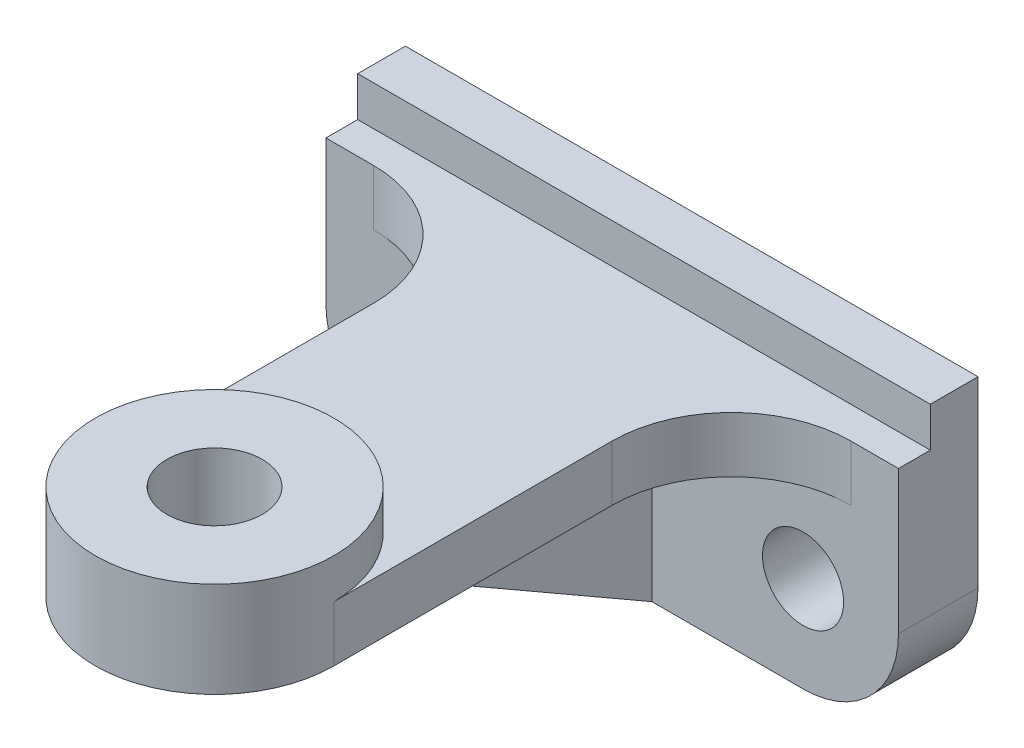
ISO-10303-21;
HEADER;
FILE_DESCRIPTION(('STEP AP214'),'2;1');
FILE_NAME('part.step','',(''),(''),'','','');
FILE_SCHEMA(('AUTOMOTIVE_DESIGN { 1 0 10303 214 1 1 1 1 }'));
ENDSEC;
DATA;
#1=APPLICATION_CONTEXT('core data for automotive mechanical design processes');
#2=APPLICATION_PROTOCOL_DEFINITION('international standard','automotive_design',2000,#1);
#3=PRODUCT_CONTEXT('',#1,'mechanical');
#4=PRODUCT('Part','Part','',(#3));
#5=PRODUCT_RELATED_PRODUCT_CATEGORY('part','',(#4));
#6=PRODUCT_DEFINITION_FORMATION('','',#4);
#7=PRODUCT_DEFINITION_CONTEXT('part definition',#1,'design');
#8=PRODUCT_DEFINITION('design','',#6,#7);
#9=PRODUCT_DEFINITION_SHAPE('','',#8);
#10=(LENGTH_UNIT() NAMED_UNIT(*) SI_UNIT(.MILLI.,.METRE.));
#11=(NAMED_UNIT(*) PLANE_ANGLE_UNIT() SI_UNIT($,.RADIAN.));
#12=(NAMED_UNIT(*) SI_UNIT($,.STERADIAN.) SOLID_ANGLE_UNIT());
#13=UNCERTAINTY_MEASURE_WITH_UNIT(LENGTH_MEASURE(1.E-05),#10,'distance_accuracy_value','');
#14=(GEOMETRIC_REPRESENTATION_CONTEXT(3) GLOBAL_UNCERTAINTY_ASSIGNED_CONTEXT((#13)) GLOBAL_UNIT_ASSIGNED_CONTEXT((#10,
#11,#12)) REPRESENTATION_CONTEXT('',''));
#15=CARTESIAN_POINT('',(0.,0.,0.));
#16=DIRECTION('',(0.,0.,1.));
#17=DIRECTION('',(1.,0.,0.));
#18=AXIS2_PLACEMENT_3D('',#15,#16,#17);
#19=CARTESIAN_POINT('',(0.,0.,10.));
#20=DIRECTION('',(0.,0.,1.));
#21=DIRECTION('',(1.,0.,0.));
#22=AXIS2_PLACEMENT_3D('',#19,#20,#21);
#23=PLANE('',#22);
#24=CARTESIAN_POINT('',(-24.,-5.5,10.));
#25=DIRECTION('',(0.,0.,1.));
#26=DIRECTION('',(1.,0.,0.));
#27=AXIS2_PLACEMENT_3D('',#24,#25,#26);
#28=CIRCLE('',#27,5.1);
#29=CARTESIAN_POINT('',(-18.9,-5.5,10.));
#30=VERTEX_POINT('',#29);
#31=EDGE_CURVE('E253',#30,#30,#28,.T.);
#32=ORIENTED_EDGE('',*,*,#31,.F.);
#33=EDGE_LOOP('',(#32));
#34=FACE_BOUND('',#33,.T.);
#35=DIRECTION('',(1.,0.,0.));
#36=VECTOR('',#35,1.);
#37=CARTESIAN_POINT('',(-36.,-17.5,10.));
#38=LINE('',#37,#36);
#39=CARTESIAN_POINT('',(-24.,-17.5,10.));
#40=VERTEX_POINT('',#39);
#41=CARTESIAN_POINT('',(-5.,-17.5,10.));
#42=VERTEX_POINT('',#41);
#43=EDGE_CURVE('E180',#40,#42,#38,.T.);
#44=ORIENTED_EDGE('',*,*,#43,.T.);
#45=DIRECTION('',(0.,1.,0.));
#46=VECTOR('',#45,1.);
#47=CARTESIAN_POINT('',(-5.,0.,10.));
#48=LINE('',#47,#46);
#49=CARTESIAN_POINT('',(-5.,5.5,10.));
#50=VERTEX_POINT('',#49);
#51=EDGE_CURVE('E179',#42,#50,#48,.T.);
#52=ORIENTED_EDGE('',*,*,#51,.T.);
#53=DIRECTION('',(1.,0.,0.));
#54=VECTOR('',#53,1.);
#55=CARTESIAN_POINT('',(0.,5.5,10.));
#56=LINE('',#55,#54);
#57=CARTESIAN_POINT('',(-30.,5.5,10.));
#58=VERTEX_POINT('',#57);
#59=EDGE_CURVE('E163',#58,#50,#56,.T.);
#60=ORIENTED_EDGE('',*,*,#59,.F.);
#61=DIRECTION('',(0.,1.,0.));
#62=VECTOR('',#61,1.);
#63=CARTESIAN_POINT('',(-30.,12.5,10.));
#64=LINE('',#63,#62);
#65=CARTESIAN_POINT('',(-30.,12.5,10.));
#66=VERTEX_POINT('',#65);
#67=EDGE_CURVE('E304',#58,#66,#64,.T.);
#68=ORIENTED_EDGE('',*,*,#67,.T.);
#69=DIRECTION('',(-1.,0.,0.));
#70=VECTOR('',#69,1.);
#71=CARTESIAN_POINT('',(36.002,12.5,10.));
#72=LINE('',#71,#70);
#73=CARTESIAN_POINT('',(-36.,12.5,10.));
#74=VERTEX_POINT('',#73);
#75=EDGE_CURVE('E244',#66,#74,#72,.T.);
#76=ORIENTED_EDGE('',*,*,#75,.T.);
#77=DIRECTION('',(0.,-1.,0.));
#78=VECTOR('',#77,1.);
#79=CARTESIAN_POINT('',(-36.,17.5,10.));
#80=LINE('',#79,#78);
#81=CARTESIAN_POINT('',(-36.,-5.5,10.));
#82=VERTEX_POINT('',#81);
#83=EDGE_CURVE('E262',#74,#82,#80,.T.);
#84=ORIENTED_EDGE('',*,*,#83,.T.);
#85=CARTESIAN_POINT('',(-24.,-5.5,10.));
#86=DIRECTION('',(0.,0.,1.));
#87=DIRECTION('',(1.,0.,0.));
#88=AXIS2_PLACEMENT_3D('',#85,#86,#87);
#89=CIRCLE('',#88,12.);
#90=EDGE_CURVE('E294',#82,#40,#89,.T.);
#91=ORIENTED_EDGE('',*,*,#90,.T.);
#92=EDGE_LOOP('',(#44,#52,#60,#68,#76,#84,#91));
#93=FACE_BOUND('',#92,.T.);
#94=ADVANCED_FACE('F44',(#34,#93),#23,.T.);
#95=CARTESIAN_POINT('',(36.002,12.5,6.));
#96=DIRECTION('',(0.,-1.,0.));
#97=DIRECTION('',(0.,0.,-1.));
#98=AXIS2_PLACEMENT_3D('',#95,#96,#97);
#99=PLANE('',#98);
#100=DIRECTION('',(-1.,0.,0.));
#101=VECTOR('',#100,1.);
#102=CARTESIAN_POINT('',(36.002,12.5,6.));
#103=LINE('',#102,#101);
#104=CARTESIAN_POINT('',(36.,12.5,6.));
#105=VERTEX_POINT('',#104);
#106=CARTESIAN_POINT('',(-36.,12.5,6.));
#107=VERTEX_POINT('',#106);
#108=EDGE_CURVE('E242',#105,#107,#103,.T.);
#109=ORIENTED_EDGE('',*,*,#108,.T.);
#110=DIRECTION('',(0.,0.,1.));
#111=VECTOR('',#110,1.);
#112=CARTESIAN_POINT('',(-36.,12.5,6.));
#113=LINE('',#112,#111);
#114=EDGE_CURVE('E228',#107,#74,#113,.T.);
#115=ORIENTED_EDGE('',*,*,#114,.T.);
#116=ORIENTED_EDGE('',*,*,#75,.F.);
#117=CARTESIAN_POINT('',(-30.,12.5,25.));
#118=DIRECTION('',(0.,-1.,0.));
#119=DIRECTION('',(0.,0.,-1.));
#120=AXIS2_PLACEMENT_3D('',#117,#118,#119);
#121=CIRCLE('',#120,15.);
#122=CARTESIAN_POINT('',(-15.,12.5,25.));
#123=VERTEX_POINT('',#122);
#124=EDGE_CURVE('E311',#66,#123,#121,.T.);
#125=ORIENTED_EDGE('',*,*,#124,.T.);
#126=DIRECTION('',(0.,0.,1.));
#127=VECTOR('',#126,1.);
#128=CARTESIAN_POINT('',(-15.,12.5,0.));
#129=LINE('',#128,#127);
#130=CARTESIAN_POINT('',(-15.,12.5,60.));
#131=VERTEX_POINT('',#130);
#132=EDGE_CURVE('E204',#123,#131,#129,.T.);
#133=ORIENTED_EDGE('',*,*,#132,.T.);
#134=CARTESIAN_POINT('',(0.,12.5,60.));
#135=DIRECTION('',(0.,1.,0.));
#136=DIRECTION('',(0.,0.,1.));
#137=AXIS2_PLACEMENT_3D('',#134,#135,#136);
#138=CIRCLE('',#137,15.);
#139=CARTESIAN_POINT('',(15.,12.5,60.));
#140=VERTEX_POINT('',#139);
#141=EDGE_CURVE('E200',#140,#131,#138,.T.);
#142=ORIENTED_EDGE('',*,*,#141,.F.);
#143=DIRECTION('',(0.,0.,-1.));
#144=VECTOR('',#143,1.);
#145=CARTESIAN_POINT('',(15.,12.5,0.));
#146=LINE('',#145,#144);
#147=CARTESIAN_POINT('',(15.,12.5,25.));
#148=VERTEX_POINT('',#147);
#149=EDGE_CURVE('E210',#140,#148,#146,.T.);
#150=ORIENTED_EDGE('',*,*,#149,.T.);
#151=CARTESIAN_POINT('',(30.,12.5,25.));
#152=DIRECTION('',(0.,-1.,0.));
#153=DIRECTION('',(0.,0.,-1.));
#154=AXIS2_PLACEMENT_3D('',#151,#152,#153);
#155=CIRCLE('',#154,15.);
#156=CARTESIAN_POINT('',(30.,12.5,10.));
#157=VERTEX_POINT('',#156);
#158=EDGE_CURVE('E52',#148,#157,#155,.T.);
#159=ORIENTED_EDGE('',*,*,#158,.T.);
#160=CARTESIAN_POINT('',(36.,12.5,10.));
#161=VERTEX_POINT('',#160);
#162=EDGE_CURVE('E232',#161,#157,#72,.T.);
#163=ORIENTED_EDGE('',*,*,#162,.F.);
#164=DIRECTION('',(0.,0.,-1.));
#165=VECTOR('',#164,1.);
#166=CARTESIAN_POINT('',(36.,12.5,6.));
#167=LINE('',#166,#165);
#168=EDGE_CURVE('E225',#161,#105,#167,.T.);
#169=ORIENTED_EDGE('',*,*,#168,.T.);
#170=EDGE_LOOP('',(#109,#115,#116,#125,#133,#142,#150,#159,#163,#169));
#171=FACE_BOUND('',#170,.T.);
#172=ADVANCED_FACE('F314',(#171),#99,.F.);
#173=DIRECTION('',(0.,1.,0.));
#174=VECTOR('',#173,1.);
#175=CARTESIAN_POINT('',(5.,0.,10.));
#176=LINE('',#175,#174);
#177=CARTESIAN_POINT('',(5.,-17.5,10.));
#178=VERTEX_POINT('',#177);
#179=CARTESIAN_POINT('',(5.,5.5,10.));
#180=VERTEX_POINT('',#179);
#181=EDGE_CURVE('E59',#178,#180,#176,.T.);
#182=ORIENTED_EDGE('',*,*,#181,.F.);
#183=CARTESIAN_POINT('',(24.,-17.5,10.));
#184=VERTEX_POINT('',#183);
#185=EDGE_CURVE('E265',#178,#184,#38,.T.);
#186=ORIENTED_EDGE('',*,*,#185,.T.);
#187=CARTESIAN_POINT('',(24.,-5.5,10.));
#188=DIRECTION('',(0.,0.,1.));
#189=DIRECTION('',(1.,0.,0.));
#190=AXIS2_PLACEMENT_3D('',#187,#188,#189);
#191=CIRCLE('',#190,12.);
#192=CARTESIAN_POINT('',(36.,-5.50000000000001,10.));
#193=VERTEX_POINT('',#192);
#194=EDGE_CURVE('E296',#184,#193,#191,.T.);
#195=ORIENTED_EDGE('',*,*,#194,.T.);
#196=DIRECTION('',(0.,1.,0.));
#197=VECTOR('',#196,1.);
#198=CARTESIAN_POINT('',(36.,17.5,10.));
#199=LINE('',#198,#197);
#200=EDGE_CURVE('E259',#193,#161,#199,.T.);
#201=ORIENTED_EDGE('',*,*,#200,.T.);
#202=ORIENTED_EDGE('',*,*,#162,.T.);
#203=DIRECTION('',(0.,1.,0.));
#204=VECTOR('',#203,1.);
#205=CARTESIAN_POINT('',(30.,5.5,10.));
#206=LINE('',#205,#204);
#207=CARTESIAN_POINT('',(30.,5.5,10.));
#208=VERTEX_POINT('',#207);
#209=EDGE_CURVE('E301',#157,#208,#206,.F.);
#210=ORIENTED_EDGE('',*,*,#209,.T.);
#211=EDGE_CURVE('E176',#180,#208,#56,.T.);
#212=ORIENTED_EDGE('',*,*,#211,.F.);
#213=EDGE_LOOP('',(#182,#186,#195,#201,#202,#210,#212));
#214=FACE_BOUND('',#213,.T.);
#215=CARTESIAN_POINT('',(24.,-5.5,10.));
#216=DIRECTION('',(0.,0.,1.));
#217=DIRECTION('',(1.,0.,0.));
#218=AXIS2_PLACEMENT_3D('',#215,#216,#217);
#219=CIRCLE('',#218,5.1);
#220=CARTESIAN_POINT('',(29.1,-5.5,10.));
#221=VERTEX_POINT('',#220);
#222=EDGE_CURVE('E247',#221,#221,#219,.T.);
#223=ORIENTED_EDGE('',*,*,#222,.F.);
#224=EDGE_LOOP('',(#223));
#225=FACE_BOUND('',#224,.T.);
#226=ADVANCED_FACE('F320',(#214,#225),#23,.T.);
#227=CARTESIAN_POINT('',(0.,0.,0.));
#228=DIRECTION('',(0.,0.,1.));
#229=DIRECTION('',(1.,0.,0.));
#230=AXIS2_PLACEMENT_3D('',#227,#228,#229);
#231=PLANE('',#230);
#232=CARTESIAN_POINT('',(24.,-5.5,0.));
#233=DIRECTION('',(0.,0.,1.));
#234=DIRECTION('',(1.,0.,0.));
#235=AXIS2_PLACEMENT_3D('',#232,#233,#234);
#236=CIRCLE('',#235,12.);
#237=CARTESIAN_POINT('',(36.,-5.50000000000001,0.));
#238=VERTEX_POINT('',#237);
#239=CARTESIAN_POINT('',(24.,-17.5,0.));
#240=VERTEX_POINT('',#239);
#241=EDGE_CURVE('E285',#238,#240,#236,.F.);
#242=ORIENTED_EDGE('',*,*,#241,.T.);
#243=DIRECTION('',(1.,0.,0.));
#244=VECTOR('',#243,1.);
#245=CARTESIAN_POINT('',(-36.,-17.5,0.));
#246=LINE('',#245,#244);
#247=CARTESIAN_POINT('',(-24.,-17.5,0.));
#248=VERTEX_POINT('',#247);
#249=EDGE_CURVE('E263',#248,#240,#246,.T.);
#250=ORIENTED_EDGE('',*,*,#249,.F.);
#251=CARTESIAN_POINT('',(-24.,-5.5,0.));
#252=DIRECTION('',(0.,0.,1.));
#253=DIRECTION('',(1.,0.,0.));
#254=AXIS2_PLACEMENT_3D('',#251,#252,#253);
#255=CIRCLE('',#254,12.);
#256=CARTESIAN_POINT('',(-36.,-5.5,0.));
#257=VERTEX_POINT('',#256);
#258=EDGE_CURVE('E283',#248,#257,#255,.F.);
#259=ORIENTED_EDGE('',*,*,#258,.T.);
#260=DIRECTION('',(0.,-1.,0.));
#261=VECTOR('',#260,1.);
#262=CARTESIAN_POINT('',(-36.,17.5,0.));
#263=LINE('',#262,#261);
#264=CARTESIAN_POINT('',(-36.,17.5,0.));
#265=VERTEX_POINT('',#264);
#266=EDGE_CURVE('E272',#265,#257,#263,.T.);
#267=ORIENTED_EDGE('',*,*,#266,.F.);
#268=DIRECTION('',(-1.,0.,0.));
#269=VECTOR('',#268,1.);
#270=CARTESIAN_POINT('',(-36.,17.5,0.));
#271=LINE('',#270,#269);
#272=CARTESIAN_POINT('',(36.,17.5,0.));
#273=VERTEX_POINT('',#272);
#274=EDGE_CURVE('E270',#273,#265,#271,.T.);
#275=ORIENTED_EDGE('',*,*,#274,.F.);
#276=DIRECTION('',(0.,1.,0.));
#277=VECTOR('',#276,1.);
#278=CARTESIAN_POINT('',(36.,17.5,0.));
#279=LINE('',#278,#277);
#280=EDGE_CURVE('E256',#238,#273,#279,.T.);
#281=ORIENTED_EDGE('',*,*,#280,.F.);
#282=EDGE_LOOP('',(#242,#250,#259,#267,#275,#281));
#283=FACE_BOUND('',#282,.T.);
#284=CARTESIAN_POINT('',(24.,-5.5,0.));
#285=DIRECTION('',(0.,0.,1.));
#286=DIRECTION('',(1.,0.,0.));
#287=AXIS2_PLACEMENT_3D('',#284,#285,#286);
#288=CIRCLE('',#287,5.1);
#289=CARTESIAN_POINT('',(29.1,-5.5,0.));
#290=VERTEX_POINT('',#289);
#291=EDGE_CURVE('E235',#290,#290,#288,.T.);
#292=ORIENTED_EDGE('',*,*,#291,.T.);
#293=EDGE_LOOP('',(#292));
#294=FACE_BOUND('',#293,.T.);
#295=CARTESIAN_POINT('',(-24.,-5.5,0.));
#296=DIRECTION('',(0.,0.,1.));
#297=DIRECTION('',(1.,0.,0.));
#298=AXIS2_PLACEMENT_3D('',#295,#296,#297);
#299=CIRCLE('',#298,5.1);
#300=CARTESIAN_POINT('',(-18.9,-5.5,0.));
#301=VERTEX_POINT('',#300);
#302=EDGE_CURVE('E250',#301,#301,#299,.T.);
#303=ORIENTED_EDGE('',*,*,#302,.T.);
#304=EDGE_LOOP('',(#303));
#305=FACE_BOUND('',#304,.T.);
#306=ADVANCED_FACE('F353',(#283,#294,#305),#231,.F.);
#307=CARTESIAN_POINT('',(36.,17.5,10.));
#308=DIRECTION('',(-1.,0.,0.));
#309=DIRECTION('',(0.,-1.,0.));
#310=AXIS2_PLACEMENT_3D('',#307,#308,#309);
#311=PLANE('',#310);
#312=DIRECTION('',(0.,0.,-1.));
#313=VECTOR('',#312,1.);
#314=CARTESIAN_POINT('',(36.,17.5,10.));
#315=LINE('',#314,#313);
#316=CARTESIAN_POINT('',(36.,17.5,6.));
#317=VERTEX_POINT('',#316);
#318=EDGE_CURVE('E278',#317,#273,#315,.T.);
#319=ORIENTED_EDGE('',*,*,#318,.F.);
#320=DIRECTION('',(0.,1.,0.));
#321=VECTOR('',#320,1.);
#322=CARTESIAN_POINT('',(36.,17.5,6.));
#323=LINE('',#322,#321);
#324=EDGE_CURVE('E236',#105,#317,#323,.T.);
#325=ORIENTED_EDGE('',*,*,#324,.F.);
#326=ORIENTED_EDGE('',*,*,#168,.F.);
#327=ORIENTED_EDGE('',*,*,#200,.F.);
#328=DIRECTION('',(0.,0.,-1.));
#329=VECTOR('',#328,1.);
#330=CARTESIAN_POINT('',(36.,-5.50000000000001,10.));
#331=LINE('',#330,#329);
#332=EDGE_CURVE('E280',#193,#238,#331,.T.);
#333=ORIENTED_EDGE('',*,*,#332,.T.);
#334=ORIENTED_EDGE('',*,*,#280,.T.);
#335=EDGE_LOOP('',(#319,#325,#326,#327,#333,#334));
#336=FACE_BOUND('',#335,.T.);
#337=ADVANCED_FACE('F364',(#336),#311,.F.);
#338=CARTESIAN_POINT('',(-36.,17.5,10.));
#339=DIRECTION('',(0.,-1.,0.));
#340=DIRECTION('',(0.,0.,-1.));
#341=AXIS2_PLACEMENT_3D('',#338,#339,#340);
#342=PLANE('',#341);
#343=ORIENTED_EDGE('',*,*,#274,.T.);
#344=DIRECTION('',(0.,0.,-1.));
#345=VECTOR('',#344,1.);
#346=CARTESIAN_POINT('',(-36.,17.5,10.));
#347=LINE('',#346,#345);
#348=CARTESIAN_POINT('',(-36.,17.5,6.));
#349=VERTEX_POINT('',#348);
#350=EDGE_CURVE('E267',#349,#265,#347,.T.);
#351=ORIENTED_EDGE('',*,*,#350,.F.);
#352=DIRECTION('',(-1.,0.,0.));
#353=VECTOR('',#352,1.);
#354=CARTESIAN_POINT('',(36.002,17.5,6.));
#355=LINE('',#354,#353);
#356=EDGE_CURVE('E238',#317,#349,#355,.T.);
#357=ORIENTED_EDGE('',*,*,#356,.F.);
#358=ORIENTED_EDGE('',*,*,#318,.T.);
#359=EDGE_LOOP('',(#343,#351,#357,#358));
#360=FACE_BOUND('',#359,.T.);
#361=ADVANCED_FACE('F359',(#360),#342,.F.);
#362=CARTESIAN_POINT('',(-36.,17.5,10.));
#363=DIRECTION('',(1.,0.,0.));
#364=DIRECTION('',(0.,0.,-1.));
#365=AXIS2_PLACEMENT_3D('',#362,#363,#364);
#366=PLANE('',#365);
#367=ORIENTED_EDGE('',*,*,#114,.F.);
#368=DIRECTION('',(0.,-1.,0.));
#369=VECTOR('',#368,1.);
#370=CARTESIAN_POINT('',(-36.,17.5,6.));
#371=LINE('',#370,#369);
#372=EDGE_CURVE('E231',#349,#107,#371,.T.);
#373=ORIENTED_EDGE('',*,*,#372,.F.);
#374=ORIENTED_EDGE('',*,*,#350,.T.);
#375=ORIENTED_EDGE('',*,*,#266,.T.);
#376=DIRECTION('',(0.,0.,-1.));
#377=VECTOR('',#376,1.);
#378=CARTESIAN_POINT('',(-36.,-5.5,10.));
#379=LINE('',#378,#377);
#380=EDGE_CURVE('E298',#257,#82,#379,.F.);
#381=ORIENTED_EDGE('',*,*,#380,.T.);
#382=ORIENTED_EDGE('',*,*,#83,.F.);
#383=EDGE_LOOP('',(#367,#373,#374,#375,#381,#382));
#384=FACE_BOUND('',#383,.T.);
#385=ADVANCED_FACE('F343',(#384),#366,.F.);
#386=CARTESIAN_POINT('',(-36.,-17.5,10.));
#387=DIRECTION('',(0.,1.,0.));
#388=DIRECTION('',(0.,0.,1.));
#389=AXIS2_PLACEMENT_3D('',#386,#387,#388);
#390=PLANE('',#389);
#391=ORIENTED_EDGE('',*,*,#185,.F.);
#392=DIRECTION('',(-1.,0.,0.));
#393=VECTOR('',#392,1.);
#394=CARTESIAN_POINT('',(-36.,-17.5,10.));
#395=LINE('',#394,#393);
#396=EDGE_CURVE('E66',#42,#178,#395,.F.);
#397=ORIENTED_EDGE('',*,*,#396,.F.);
#398=ORIENTED_EDGE('',*,*,#43,.F.);
#399=DIRECTION('',(0.,0.,-1.));
#400=VECTOR('',#399,1.);
#401=CARTESIAN_POINT('',(-24.,-17.5,10.));
#402=LINE('',#401,#400);
#403=EDGE_CURVE('E288',#40,#248,#402,.T.);
#404=ORIENTED_EDGE('',*,*,#403,.T.);
#405=ORIENTED_EDGE('',*,*,#249,.T.);
#406=DIRECTION('',(0.,0.,-1.));
#407=VECTOR('',#406,1.);
#408=CARTESIAN_POINT('',(24.,-17.5,10.));
#409=LINE('',#408,#407);
#410=EDGE_CURVE('E291',#240,#184,#409,.F.);
#411=ORIENTED_EDGE('',*,*,#410,.T.);
#412=EDGE_LOOP('',(#391,#397,#398,#404,#405,#411));
#413=FACE_BOUND('',#412,.T.);
#414=ADVANCED_FACE('F348',(#413),#390,.F.);
#415=CARTESIAN_POINT('',(-24.,-5.5,10.));
#416=DIRECTION('',(0.,0.,-1.));
#417=DIRECTION('',(-1.,0.,0.));
#418=AXIS2_PLACEMENT_3D('',#415,#416,#417);
#419=CYLINDRICAL_SURFACE('',#418,5.1);
#420=ORIENTED_EDGE('',*,*,#31,.T.);
#421=EDGE_LOOP('',(#420));
#422=FACE_BOUND('',#421,.T.);
#423=ORIENTED_EDGE('',*,*,#302,.F.);
#424=EDGE_LOOP('',(#423));
#425=FACE_BOUND('',#424,.T.);
#426=ADVANCED_FACE('F407',(#422,#425),#419,.F.);
#427=CARTESIAN_POINT('',(24.,-5.5,10.));
#428=DIRECTION('',(0.,0.,-1.));
#429=DIRECTION('',(-1.,0.,0.));
#430=AXIS2_PLACEMENT_3D('',#427,#428,#429);
#431=CYLINDRICAL_SURFACE('',#430,5.1);
#432=ORIENTED_EDGE('',*,*,#222,.T.);
#433=EDGE_LOOP('',(#432));
#434=FACE_BOUND('',#433,.T.);
#435=ORIENTED_EDGE('',*,*,#291,.F.);
#436=EDGE_LOOP('',(#435));
#437=FACE_BOUND('',#436,.T.);
#438=ADVANCED_FACE('F414',(#434,#437),#431,.F.);
#439=CARTESIAN_POINT('',(24.,-5.5,10.));
#440=DIRECTION('',(0.,0.,-1.));
#441=DIRECTION('',(-1.,0.,0.));
#442=AXIS2_PLACEMENT_3D('',#439,#440,#441);
#443=CYLINDRICAL_SURFACE('',#442,12.);
#444=ORIENTED_EDGE('',*,*,#194,.F.);
#445=ORIENTED_EDGE('',*,*,#410,.F.);
#446=ORIENTED_EDGE('',*,*,#241,.F.);
#447=ORIENTED_EDGE('',*,*,#332,.F.);
#448=EDGE_LOOP('',(#444,#445,#446,#447));
#449=FACE_BOUND('',#448,.T.);
#450=ADVANCED_FACE('F369',(#449),#443,.T.);
#451=CARTESIAN_POINT('',(-24.,-5.5,10.));
#452=DIRECTION('',(0.,0.,-1.));
#453=DIRECTION('',(-1.,0.,0.));
#454=AXIS2_PLACEMENT_3D('',#451,#452,#453);
#455=CYLINDRICAL_SURFACE('',#454,12.);
#456=ORIENTED_EDGE('',*,*,#90,.F.);
#457=ORIENTED_EDGE('',*,*,#380,.F.);
#458=ORIENTED_EDGE('',*,*,#258,.F.);
#459=ORIENTED_EDGE('',*,*,#403,.F.);
#460=EDGE_LOOP('',(#456,#457,#458,#459));
#461=FACE_BOUND('',#460,.T.);
#462=ADVANCED_FACE('F350',(#461),#455,.T.);
#463=CARTESIAN_POINT('',(36.002,17.5,6.));
#464=DIRECTION('',(0.,0.,-1.));
#465=DIRECTION('',(0.,1.,0.));
#466=AXIS2_PLACEMENT_3D('',#463,#464,#465);
#467=PLANE('',#466);
#468=ORIENTED_EDGE('',*,*,#356,.T.);
#469=ORIENTED_EDGE('',*,*,#372,.T.);
#470=ORIENTED_EDGE('',*,*,#108,.F.);
#471=ORIENTED_EDGE('',*,*,#324,.T.);
#472=EDGE_LOOP('',(#468,#469,#470,#471));
#473=FACE_BOUND('',#472,.T.);
#474=ADVANCED_FACE('F416',(#473),#467,.F.);
#475=CARTESIAN_POINT('',(-15.,5.5,0.));
#476=DIRECTION('',(-1.,0.,0.));
#477=DIRECTION('',(0.,0.,1.));
#478=AXIS2_PLACEMENT_3D('',#475,#476,#477);
#479=PLANE('',#478);
#480=ORIENTED_EDGE('',*,*,#132,.F.);
#481=DIRECTION('',(0.,1.,0.));
#482=VECTOR('',#481,1.);
#483=CARTESIAN_POINT('',(-15.,5.5,25.));
#484=LINE('',#483,#482);
#485=CARTESIAN_POINT('',(-15.,5.5,25.));
#486=VERTEX_POINT('',#485);
#487=EDGE_CURVE('E306',#123,#486,#484,.F.);
#488=ORIENTED_EDGE('',*,*,#487,.T.);
#489=DIRECTION('',(0.,0.,1.));
#490=VECTOR('',#489,1.);
#491=CARTESIAN_POINT('',(-15.,5.5,0.));
#492=LINE('',#491,#490);
#493=CARTESIAN_POINT('',(-15.,5.5,60.));
#494=VERTEX_POINT('',#493);
#495=EDGE_CURVE('E209',#486,#494,#492,.T.);
#496=ORIENTED_EDGE('',*,*,#495,.T.);
#497=DIRECTION('',(0.,1.,0.));
#498=VECTOR('',#497,1.);
#499=CARTESIAN_POINT('',(-15.,5.5,60.));
#500=LINE('',#499,#498);
#501=EDGE_CURVE('E175',#494,#131,#500,.T.);
#502=ORIENTED_EDGE('',*,*,#501,.T.);
#503=EDGE_LOOP('',(#480,#488,#496,#502));
#504=FACE_BOUND('',#503,.T.);
#505=ADVANCED_FACE('F336',(#504),#479,.T.);
#506=CARTESIAN_POINT('',(15.,5.5,0.));
#507=DIRECTION('',(1.,0.,0.));
#508=DIRECTION('',(0.,0.,-1.));
#509=AXIS2_PLACEMENT_3D('',#506,#507,#508);
#510=PLANE('',#509);
#511=DIRECTION('',(0.,0.,-1.));
#512=VECTOR('',#511,1.);
#513=CARTESIAN_POINT('',(15.,5.5,0.));
#514=LINE('',#513,#512);
#515=CARTESIAN_POINT('',(15.,5.5,60.));
#516=VERTEX_POINT('',#515);
#517=CARTESIAN_POINT('',(15.,5.5,25.));
#518=VERTEX_POINT('',#517);
#519=EDGE_CURVE('E215',#516,#518,#514,.T.);
#520=ORIENTED_EDGE('',*,*,#519,.T.);
#521=DIRECTION('',(0.,1.,0.));
#522=VECTOR('',#521,1.);
#523=CARTESIAN_POINT('',(15.,12.5,25.));
#524=LINE('',#523,#522);
#525=EDGE_CURVE('E308',#518,#148,#524,.T.);
#526=ORIENTED_EDGE('',*,*,#525,.T.);
#527=ORIENTED_EDGE('',*,*,#149,.F.);
#528=DIRECTION('',(0.,1.,0.));
#529=VECTOR('',#528,1.);
#530=CARTESIAN_POINT('',(15.,5.5,60.));
#531=LINE('',#530,#529);
#532=EDGE_CURVE('E222',#516,#140,#531,.T.);
#533=ORIENTED_EDGE('',*,*,#532,.F.);
#534=EDGE_LOOP('',(#520,#526,#527,#533));
#535=FACE_BOUND('',#534,.T.);
#536=ADVANCED_FACE('F327',(#535),#510,.T.);
#537=CARTESIAN_POINT('',(0.,5.5,60.));
#538=DIRECTION('',(0.,1.,0.));
#539=DIRECTION('',(0.,0.,1.));
#540=AXIS2_PLACEMENT_3D('',#537,#538,#539);
#541=CYLINDRICAL_SURFACE('',#540,6.);
#542=CARTESIAN_POINT('',(0.,17.5,60.));
#543=DIRECTION('',(0.,1.,0.));
#544=DIRECTION('',(0.,0.,1.));
#545=AXIS2_PLACEMENT_3D('',#542,#543,#544);
#546=CIRCLE('',#545,6.);
#547=CARTESIAN_POINT('',(0.,17.5,66.));
#548=VERTEX_POINT('',#547);
#549=EDGE_CURVE('E197',#548,#548,#546,.T.);
#550=ORIENTED_EDGE('',*,*,#549,.T.);
#551=EDGE_LOOP('',(#550));
#552=FACE_BOUND('',#551,.T.);
#553=CARTESIAN_POINT('',(0.,5.5,60.));
#554=DIRECTION('',(0.,1.,0.));
#555=DIRECTION('',(0.,0.,1.));
#556=AXIS2_PLACEMENT_3D('',#553,#554,#555);
#557=CIRCLE('',#556,6.);
#558=CARTESIAN_POINT('',(0.,5.5,66.));
#559=VERTEX_POINT('',#558);
#560=EDGE_CURVE('E206',#559,#559,#557,.T.);
#561=ORIENTED_EDGE('',*,*,#560,.F.);
#562=EDGE_LOOP('',(#561));
#563=FACE_BOUND('',#562,.T.);
#564=ADVANCED_FACE('F435',(#552,#563),#541,.F.);
#565=CARTESIAN_POINT('',(0.,5.5,60.));
#566=DIRECTION('',(0.,1.,0.));
#567=DIRECTION('',(0.,0.,1.));
#568=AXIS2_PLACEMENT_3D('',#565,#566,#567);
#569=CYLINDRICAL_SURFACE('',#568,15.);
#570=ORIENTED_EDGE('',*,*,#141,.T.);
#571=ORIENTED_EDGE('',*,*,#501,.F.);
#572=CARTESIAN_POINT('',(0.,5.5,60.));
#573=DIRECTION('',(0.,1.,0.));
#574=DIRECTION('',(0.,0.,1.));
#575=AXIS2_PLACEMENT_3D('',#572,#573,#574);
#576=CIRCLE('',#575,15.);
#577=EDGE_CURVE('E212',#494,#516,#576,.T.);
#578=ORIENTED_EDGE('',*,*,#577,.T.);
#579=ORIENTED_EDGE('',*,*,#532,.T.);
#580=EDGE_LOOP('',(#570,#571,#578,#579));
#581=FACE_BOUND('',#580,.T.);
#582=CARTESIAN_POINT('',(0.,17.5,60.));
#583=DIRECTION('',(0.,1.,0.));
#584=DIRECTION('',(0.,0.,1.));
#585=AXIS2_PLACEMENT_3D('',#582,#583,#584);
#586=CIRCLE('',#585,15.);
#587=CARTESIAN_POINT('',(0.,17.5,75.));
#588=VERTEX_POINT('',#587);
#589=EDGE_CURVE('E201',#588,#588,#586,.T.);
#590=ORIENTED_EDGE('',*,*,#589,.F.);
#591=EDGE_LOOP('',(#590));
#592=FACE_BOUND('',#591,.T.);
#593=ADVANCED_FACE('F329',(#581,#592),#569,.T.);
#594=CARTESIAN_POINT('',(0.,5.5,0.));
#595=DIRECTION('',(0.,1.,0.));
#596=DIRECTION('',(0.,0.,1.));
#597=AXIS2_PLACEMENT_3D('',#594,#595,#596);
#598=PLANE('',#597);
#599=ORIENTED_EDGE('',*,*,#560,.T.);
#600=EDGE_LOOP('',(#599));
#601=FACE_BOUND('',#600,.T.);
#602=DIRECTION('',(-1.,0.,0.));
#603=VECTOR('',#602,1.);
#604=CARTESIAN_POINT('',(0.,5.5,50.));
#605=LINE('',#604,#603);
#606=CARTESIAN_POINT('',(-5.,5.5,50.));
#607=VERTEX_POINT('',#606);
#608=CARTESIAN_POINT('',(5.,5.5,50.));
#609=VERTEX_POINT('',#608);
#610=EDGE_CURVE('E194',#607,#609,#605,.F.);
#611=ORIENTED_EDGE('',*,*,#610,.T.);
#612=DIRECTION('',(0.,0.,-1.));
#613=VECTOR('',#612,1.);
#614=CARTESIAN_POINT('',(5.,5.5,0.));
#615=LINE('',#614,#613);
#616=EDGE_CURVE('E189',#609,#180,#615,.T.);
#617=ORIENTED_EDGE('',*,*,#616,.T.);
#618=ORIENTED_EDGE('',*,*,#211,.T.);
#619=CARTESIAN_POINT('',(30.,5.5,25.));
#620=DIRECTION('',(0.,1.,0.));
#621=DIRECTION('',(0.,0.,1.));
#622=AXIS2_PLACEMENT_3D('',#619,#620,#621);
#623=CIRCLE('',#622,15.);
#624=EDGE_CURVE('E11',#208,#518,#623,.T.);
#625=ORIENTED_EDGE('',*,*,#624,.T.);
#626=ORIENTED_EDGE('',*,*,#519,.F.);
#627=ORIENTED_EDGE('',*,*,#577,.F.);
#628=ORIENTED_EDGE('',*,*,#495,.F.);
#629=CARTESIAN_POINT('',(-30.,5.5,25.));
#630=DIRECTION('',(0.,1.,0.));
#631=DIRECTION('',(0.,0.,1.));
#632=AXIS2_PLACEMENT_3D('',#629,#630,#631);
#633=CIRCLE('',#632,15.);
#634=EDGE_CURVE('E171',#486,#58,#633,.T.);
#635=ORIENTED_EDGE('',*,*,#634,.T.);
#636=ORIENTED_EDGE('',*,*,#59,.T.);
#637=DIRECTION('',(0.,0.,-1.));
#638=VECTOR('',#637,1.);
#639=CARTESIAN_POINT('',(-5.,5.5,0.));
#640=LINE('',#639,#638);
#641=EDGE_CURVE('E167',#607,#50,#640,.T.);
#642=ORIENTED_EDGE('',*,*,#641,.F.);
#643=EDGE_LOOP('',(#611,#617,#618,#625,#626,#627,#628,#635,#636,#642));
#644=FACE_BOUND('',#643,.T.);
#645=ADVANCED_FACE('F165',(#601,#644),#598,.F.);
#646=CARTESIAN_POINT('',(0.,17.5,60.));
#647=DIRECTION('',(0.,1.,0.));
#648=DIRECTION('',(0.,0.,1.));
#649=AXIS2_PLACEMENT_3D('',#646,#647,#648);
#650=PLANE('',#649);
#651=ORIENTED_EDGE('',*,*,#549,.F.);
#652=EDGE_LOOP('',(#651));
#653=FACE_BOUND('',#652,.T.);
#654=ORIENTED_EDGE('',*,*,#589,.T.);
#655=EDGE_LOOP('',(#654));
#656=FACE_BOUND('',#655,.T.);
#657=ADVANCED_FACE('F418',(#653,#656),#650,.T.);
#658=CARTESIAN_POINT('',(-30.,0.,25.));
#659=DIRECTION('',(0.,-1.,0.));
#660=DIRECTION('',(0.,0.,-1.));
#661=AXIS2_PLACEMENT_3D('',#658,#659,#660);
#662=CYLINDRICAL_SURFACE('',#661,15.);
#663=ORIENTED_EDGE('',*,*,#634,.F.);
#664=ORIENTED_EDGE('',*,*,#487,.F.);
#665=ORIENTED_EDGE('',*,*,#124,.F.);
#666=ORIENTED_EDGE('',*,*,#67,.F.);
#667=EDGE_LOOP('',(#663,#664,#665,#666));
#668=FACE_BOUND('',#667,.T.);
#669=ADVANCED_FACE('F338',(#668),#662,.F.);
#670=CARTESIAN_POINT('',(30.,5.5,25.));
#671=DIRECTION('',(0.,-1.,0.));
#672=DIRECTION('',(0.,0.,-1.));
#673=AXIS2_PLACEMENT_3D('',#670,#671,#672);
#674=CYLINDRICAL_SURFACE('',#673,15.);
#675=ORIENTED_EDGE('',*,*,#624,.F.);
#676=ORIENTED_EDGE('',*,*,#209,.F.);
#677=ORIENTED_EDGE('',*,*,#158,.F.);
#678=ORIENTED_EDGE('',*,*,#525,.F.);
#679=EDGE_LOOP('',(#675,#676,#677,#678));
#680=FACE_BOUND('',#679,.T.);
#681=ADVANCED_FACE('F46',(#680),#674,.F.);
#682=CARTESIAN_POINT('',(0.,-17.5,10.));
#683=DIRECTION('',(0.,0.866906303057535,-0.498471124258083));
#684=DIRECTION('',(0.,0.498471124258083,0.866906303057535));
#685=AXIS2_PLACEMENT_3D('',#682,#683,#684);
#686=PLANE('',#685);
#687=DIRECTION('',(0.,0.498471124258083,0.866906303057535));
#688=VECTOR('',#687,1.);
#689=CARTESIAN_POINT('',(-5.,-17.5,10.));
#690=LINE('',#689,#688);
#691=EDGE_CURVE('E187',#42,#607,#690,.T.);
#692=ORIENTED_EDGE('',*,*,#691,.F.);
#693=ORIENTED_EDGE('',*,*,#396,.T.);
#694=DIRECTION('',(0.,0.498471124258083,0.866906303057535));
#695=VECTOR('',#694,1.);
#696=CARTESIAN_POINT('',(5.,-17.5,10.));
#697=LINE('',#696,#695);
#698=EDGE_CURVE('E184',#178,#609,#697,.T.);
#699=ORIENTED_EDGE('',*,*,#698,.T.);
#700=ORIENTED_EDGE('',*,*,#610,.F.);
#701=EDGE_LOOP('',(#692,#693,#699,#700));
#702=FACE_BOUND('',#701,.T.);
#703=ADVANCED_FACE('F373',(#702),#686,.F.);
#704=CARTESIAN_POINT('',(5.,0.,37.5));
#705=DIRECTION('',(1.,0.,0.));
#706=DIRECTION('',(0.,0.,-1.));
#707=AXIS2_PLACEMENT_3D('',#704,#705,#706);
#708=PLANE('',#707);
#709=ORIENTED_EDGE('',*,*,#616,.F.);
#710=ORIENTED_EDGE('',*,*,#698,.F.);
#711=ORIENTED_EDGE('',*,*,#181,.T.);
#712=EDGE_LOOP('',(#709,#710,#711));
#713=FACE_BOUND('',#712,.T.);
#714=ADVANCED_FACE('F376',(#713),#708,.T.);
#715=CARTESIAN_POINT('',(-5.,0.,37.5));
#716=DIRECTION('',(1.,0.,0.));
#717=DIRECTION('',(0.,0.,-1.));
#718=AXIS2_PLACEMENT_3D('',#715,#716,#717);
#719=PLANE('',#718);
#720=ORIENTED_EDGE('',*,*,#691,.T.);
#721=ORIENTED_EDGE('',*,*,#641,.T.);
#722=ORIENTED_EDGE('',*,*,#51,.F.);
#723=EDGE_LOOP('',(#720,#721,#722));
#724=FACE_BOUND('',#723,.T.);
#725=ADVANCED_FACE('F186',(#724),#719,.F.);
#726=CLOSED_SHELL('',(#94,#172,#226,#306,#337,#361,#385,#414,#426,#438,#450,#462,#474,#505,#536,
#564,#593,#645,#657,#669,#681,#703,#714,#725));
#727=MANIFOLD_SOLID_BREP('B2',#726);
#728=ADVANCED_BREP_SHAPE_REPRESENTATION('',(#18,#727),#14);
#729=SHAPE_DEFINITION_REPRESENTATION(#9,#728);
ENDSEC;
END-ISO-10303-21;
